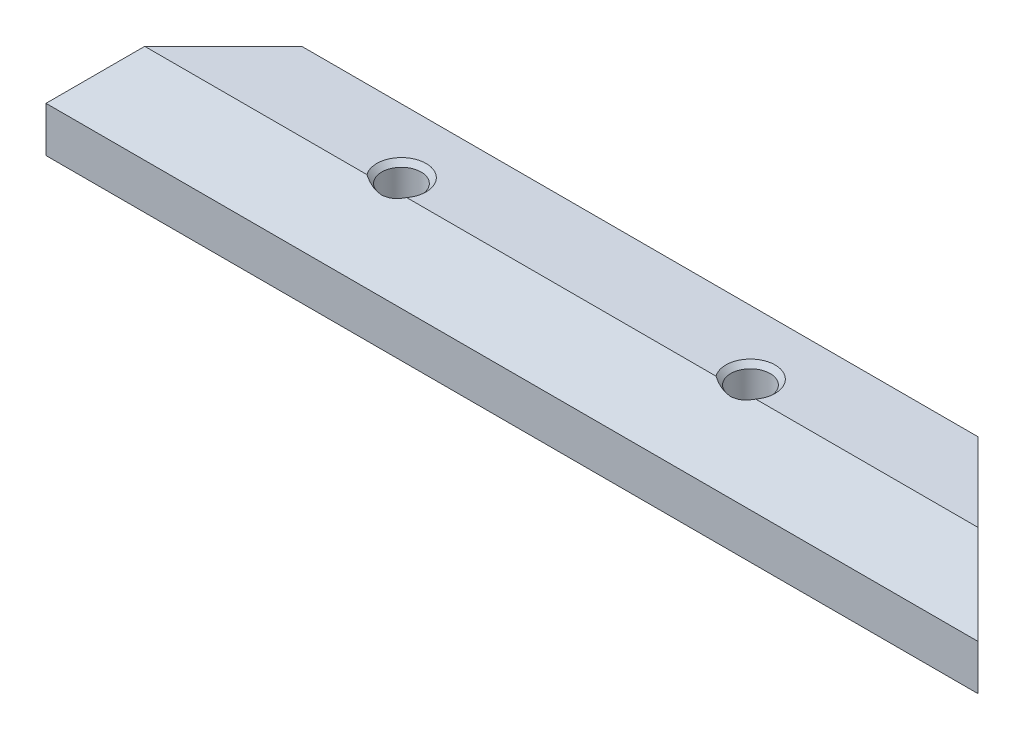
ISO-10303-21;
HEADER;
FILE_DESCRIPTION(('STEP AP214'),'2;1');
FILE_NAME('part.step','',(''),(''),'','','');
FILE_SCHEMA(('AUTOMOTIVE_DESIGN { 1 0 10303 214 1 1 1 1 }'));
ENDSEC;
DATA;
#1=APPLICATION_CONTEXT('core data for automotive mechanical design processes');
#2=APPLICATION_PROTOCOL_DEFINITION('international standard','automotive_design',2000,#1);
#3=PRODUCT_CONTEXT('',#1,'mechanical');
#4=PRODUCT('Part','Part','',(#3));
#5=PRODUCT_RELATED_PRODUCT_CATEGORY('part','',(#4));
#6=PRODUCT_DEFINITION_FORMATION('','',#4);
#7=PRODUCT_DEFINITION_CONTEXT('part definition',#1,'design');
#8=PRODUCT_DEFINITION('design','',#6,#7);
#9=PRODUCT_DEFINITION_SHAPE('','',#8);
#10=(LENGTH_UNIT() NAMED_UNIT(*) SI_UNIT(.MILLI.,.METRE.));
#11=(NAMED_UNIT(*) PLANE_ANGLE_UNIT() SI_UNIT($,.RADIAN.));
#12=(NAMED_UNIT(*) SI_UNIT($,.STERADIAN.) SOLID_ANGLE_UNIT());
#13=UNCERTAINTY_MEASURE_WITH_UNIT(LENGTH_MEASURE(1.E-05),#10,'distance_accuracy_value','');
#14=(GEOMETRIC_REPRESENTATION_CONTEXT(3) GLOBAL_UNCERTAINTY_ASSIGNED_CONTEXT((#13)) GLOBAL_UNIT_ASSIGNED_CONTEXT((#10,
#11,#12)) REPRESENTATION_CONTEXT('',''));
#15=CARTESIAN_POINT('',(0.,0.,0.));
#16=DIRECTION('',(0.,0.,1.));
#17=DIRECTION('',(1.,0.,0.));
#18=AXIS2_PLACEMENT_3D('',#15,#16,#17);
#19=CARTESIAN_POINT('',(35.3553390593204,0.,-12.955));
#20=DIRECTION('',(0.,1.,0.));
#21=DIRECTION('',(0.,0.,1.));
#22=AXIS2_PLACEMENT_3D('',#19,#20,#21);
#23=CYLINDRICAL_SURFACE('',#22,1.99999999999994);
#24=CARTESIAN_POINT('',(35.3553390593204,0.,-12.955));
#25=DIRECTION('',(0.,1.,0.));
#26=DIRECTION('',(0.,0.,1.));
#27=AXIS2_PLACEMENT_3D('',#24,#25,#26);
#28=CIRCLE('',#27,1.99999999999994);
#29=CARTESIAN_POINT('',(35.3553390593204,0.,-10.9550000000001));
#30=VERTEX_POINT('',#29);
#31=EDGE_CURVE('E241',#30,#30,#28,.T.);
#32=ORIENTED_EDGE('',*,*,#31,.F.);
#33=EDGE_LOOP('',(#32));
#34=FACE_BOUND('',#33,.T.);
#35=CARTESIAN_POINT('',(35.3553390593204,3.,-12.955));
#36=DIRECTION('',(0.,1.,0.));
#37=DIRECTION('',(0.,0.,1.));
#38=AXIS2_PLACEMENT_3D('',#35,#36,#37);
#39=CIRCLE('',#38,1.99999999999994);
#40=CARTESIAN_POINT('',(35.3553390593204,3.,-10.9550000000001));
#41=VERTEX_POINT('',#40);
#42=EDGE_CURVE('E237',#41,#41,#39,.F.);
#43=ORIENTED_EDGE('',*,*,#42,.F.);
#44=EDGE_LOOP('',(#43));
#45=FACE_BOUND('',#44,.T.);
#46=ADVANCED_FACE('F44',(#34,#45),#23,.F.);
#47=CARTESIAN_POINT('',(-35.3553390593342,0.,-12.955));
#48=DIRECTION('',(0.,1.,0.));
#49=DIRECTION('',(0.,0.,1.));
#50=AXIS2_PLACEMENT_3D('',#47,#48,#49);
#51=CYLINDRICAL_SURFACE('',#50,2.);
#52=CARTESIAN_POINT('',(-35.3553390593342,0.,-12.955));
#53=DIRECTION('',(0.,1.,0.));
#54=DIRECTION('',(0.,0.,1.));
#55=AXIS2_PLACEMENT_3D('',#52,#53,#54);
#56=CIRCLE('',#55,2.);
#57=CARTESIAN_POINT('',(-35.3553390593342,0.,-10.955));
#58=VERTEX_POINT('',#57);
#59=EDGE_CURVE('E172',#58,#58,#56,.T.);
#60=ORIENTED_EDGE('',*,*,#59,.F.);
#61=EDGE_LOOP('',(#60));
#62=FACE_BOUND('',#61,.T.);
#63=CARTESIAN_POINT('',(-35.3553390593342,3.,-12.955));
#64=DIRECTION('',(0.,1.,0.));
#65=DIRECTION('',(0.,0.,1.));
#66=AXIS2_PLACEMENT_3D('',#63,#64,#65);
#67=CIRCLE('',#66,2.);
#68=CARTESIAN_POINT('',(-35.3553390593342,3.,-10.955));
#69=VERTEX_POINT('',#68);
#70=EDGE_CURVE('E234',#69,#69,#67,.F.);
#71=ORIENTED_EDGE('',*,*,#70,.F.);
#72=EDGE_LOOP('',(#71));
#73=FACE_BOUND('',#72,.T.);
#74=ADVANCED_FACE('F314',(#62,#73),#51,.F.);
#75=CARTESIAN_POINT('',(68.5,3.,-25.91));
#76=DIRECTION('',(-0.707106781186549,0.,0.707106781186546));
#77=DIRECTION('',(0.707106781186546,0.,0.707106781186549));
#78=AXIS2_PLACEMENT_3D('',#75,#76,#77);
#79=PLANE('',#78);
#80=DIRECTION('',(-0.707106781186546,0.,-0.707106781186549));
#81=VECTOR('',#80,1.);
#82=CARTESIAN_POINT('',(68.5,19.17,-25.91));
#83=LINE('',#82,#81);
#84=CARTESIAN_POINT('',(84.41,19.17,-10.));
#85=VERTEX_POINT('',#84);
#86=CARTESIAN_POINT('',(68.5,19.17,-25.91));
#87=VERTEX_POINT('',#86);
#88=EDGE_CURVE('E140',#85,#87,#83,.T.);
#89=ORIENTED_EDGE('',*,*,#88,.F.);
#90=DIRECTION('',(-0.577350269189624,0.577350269189628,-0.577350269189626));
#91=VECTOR('',#90,1.);
#92=CARTESIAN_POINT('',(56.2733333333335,47.3066666666666,-38.1366666666666));
#93=LINE('',#92,#91);
#94=CARTESIAN_POINT('',(94.4099999999999,9.16999999999999,0.));
#95=VERTEX_POINT('',#94);
#96=EDGE_CURVE('E220',#85,#95,#93,.F.);
#97=ORIENTED_EDGE('',*,*,#96,.T.);
#98=DIRECTION('',(0.,-1.,0.));
#99=VECTOR('',#98,1.);
#100=CARTESIAN_POINT('',(94.4099999999999,3.,0.));
#101=LINE('',#100,#99);
#102=CARTESIAN_POINT('',(94.4099999999999,0.,0.));
#103=VERTEX_POINT('',#102);
#104=EDGE_CURVE('E204',#95,#103,#101,.T.);
#105=ORIENTED_EDGE('',*,*,#104,.T.);
#106=DIRECTION('',(-0.707106781186546,0.,-0.707106781186549));
#107=VECTOR('',#106,1.);
#108=CARTESIAN_POINT('',(68.5,0.,-25.91));
#109=LINE('',#108,#107);
#110=CARTESIAN_POINT('',(68.5,0.,-25.91));
#111=VERTEX_POINT('',#110);
#112=EDGE_CURVE('E158',#103,#111,#109,.T.);
#113=ORIENTED_EDGE('',*,*,#112,.T.);
#114=DIRECTION('',(0.,-1.,0.));
#115=VECTOR('',#114,1.);
#116=CARTESIAN_POINT('',(68.5,3.,-25.91));
#117=LINE('',#116,#115);
#118=EDGE_CURVE('E155',#87,#111,#117,.T.);
#119=ORIENTED_EDGE('',*,*,#118,.F.);
#120=EDGE_LOOP('',(#89,#97,#105,#113,#119));
#121=FACE_BOUND('',#120,.T.);
#122=ADVANCED_FACE('F156',(#121),#79,.F.);
#123=CARTESIAN_POINT('',(-68.5,3.,-25.91));
#124=DIRECTION('',(0.,0.,1.));
#125=DIRECTION('',(1.,0.,0.));
#126=AXIS2_PLACEMENT_3D('',#123,#124,#125);
#127=PLANE('',#126);
#128=DIRECTION('',(0.,-1.,0.));
#129=VECTOR('',#128,1.);
#130=CARTESIAN_POINT('',(64.4969448888859,15.,-25.91));
#131=LINE('',#130,#129);
#132=CARTESIAN_POINT('',(64.4969448888859,15.,-25.91));
#133=VERTEX_POINT('',#132);
#134=CARTESIAN_POINT('',(64.4969448888859,3.,-25.91));
#135=VERTEX_POINT('',#134);
#136=EDGE_CURVE('E199',#133,#135,#131,.T.);
#137=ORIENTED_EDGE('',*,*,#136,.F.);
#138=DIRECTION('',(-1.,0.,0.));
#139=VECTOR('',#138,1.);
#140=CARTESIAN_POINT('',(-68.5,15.,-25.91));
#141=LINE('',#140,#139);
#142=CARTESIAN_POINT('',(-64.496944888886,15.,-25.91));
#143=VERTEX_POINT('',#142);
#144=EDGE_CURVE('E151',#133,#143,#141,.T.);
#145=ORIENTED_EDGE('',*,*,#144,.T.);
#146=DIRECTION('',(0.,-1.,0.));
#147=VECTOR('',#146,1.);
#148=CARTESIAN_POINT('',(-64.496944888886,15.,-25.91));
#149=LINE('',#148,#147);
#150=CARTESIAN_POINT('',(-64.496944888886,3.,-25.91));
#151=VERTEX_POINT('',#150);
#152=EDGE_CURVE('E183',#143,#151,#149,.T.);
#153=ORIENTED_EDGE('',*,*,#152,.T.);
#154=DIRECTION('',(-1.,0.,0.));
#155=VECTOR('',#154,1.);
#156=CARTESIAN_POINT('',(-68.5,3.,-25.91));
#157=LINE('',#156,#155);
#158=EDGE_CURVE('E202',#135,#151,#157,.T.);
#159=ORIENTED_EDGE('',*,*,#158,.F.);
#160=EDGE_LOOP('',(#137,#145,#153,#159));
#161=FACE_BOUND('',#160,.T.);
#162=DIRECTION('',(-1.,0.,0.));
#163=VECTOR('',#162,1.);
#164=CARTESIAN_POINT('',(-68.5,0.,-25.91));
#165=LINE('',#164,#163);
#166=CARTESIAN_POINT('',(-68.5,0.,-25.91));
#167=VERTEX_POINT('',#166);
#168=EDGE_CURVE('E207',#111,#167,#165,.T.);
#169=ORIENTED_EDGE('',*,*,#168,.T.);
#170=DIRECTION('',(0.,-1.,0.));
#171=VECTOR('',#170,1.);
#172=CARTESIAN_POINT('',(-68.5,3.,-25.91));
#173=LINE('',#172,#171);
#174=CARTESIAN_POINT('',(-68.5,19.17,-25.91));
#175=VERTEX_POINT('',#174);
#176=EDGE_CURVE('E160',#175,#167,#173,.T.);
#177=ORIENTED_EDGE('',*,*,#176,.F.);
#178=DIRECTION('',(-1.,0.,0.));
#179=VECTOR('',#178,1.);
#180=CARTESIAN_POINT('',(-68.5,19.17,-25.91));
#181=LINE('',#180,#179);
#182=EDGE_CURVE('E145',#87,#175,#181,.T.);
#183=ORIENTED_EDGE('',*,*,#182,.F.);
#184=ORIENTED_EDGE('',*,*,#118,.T.);
#185=EDGE_LOOP('',(#169,#177,#183,#184));
#186=FACE_BOUND('',#185,.T.);
#187=ADVANCED_FACE('F162',(#161,#186),#127,.F.);
#188=CARTESIAN_POINT('',(-94.4099999999999,3.,0.));
#189=DIRECTION('',(0.707106781186549,0.,0.707106781186547));
#190=DIRECTION('',(0.707106781186547,0.,-0.707106781186549));
#191=AXIS2_PLACEMENT_3D('',#188,#189,#190);
#192=PLANE('',#191);
#193=DIRECTION('',(0.,-1.,0.));
#194=VECTOR('',#193,1.);
#195=CARTESIAN_POINT('',(-94.4099999999999,3.,0.));
#196=LINE('',#195,#194);
#197=CARTESIAN_POINT('',(-94.4099999999999,9.16999999999999,0.));
#198=VERTEX_POINT('',#197);
#199=CARTESIAN_POINT('',(-94.4099999999999,0.,0.));
#200=VERTEX_POINT('',#199);
#201=EDGE_CURVE('E215',#198,#200,#196,.T.);
#202=ORIENTED_EDGE('',*,*,#201,.F.);
#203=DIRECTION('',(-0.577350269189624,-0.577350269189628,0.577350269189626));
#204=VECTOR('',#203,1.);
#205=CARTESIAN_POINT('',(-56.2733333333334,47.3066666666666,-38.1366666666666));
#206=LINE('',#205,#204);
#207=CARTESIAN_POINT('',(-84.4099999999999,19.17,-10.));
#208=VERTEX_POINT('',#207);
#209=EDGE_CURVE('E225',#198,#208,#206,.F.);
#210=ORIENTED_EDGE('',*,*,#209,.T.);
#211=DIRECTION('',(-0.707106781186546,0.,0.707106781186548));
#212=VECTOR('',#211,1.);
#213=CARTESIAN_POINT('',(-94.4099999999999,19.17,0.));
#214=LINE('',#213,#212);
#215=EDGE_CURVE('E164',#175,#208,#214,.T.);
#216=ORIENTED_EDGE('',*,*,#215,.F.);
#217=ORIENTED_EDGE('',*,*,#176,.T.);
#218=DIRECTION('',(-0.707106781186546,0.,0.707106781186548));
#219=VECTOR('',#218,1.);
#220=CARTESIAN_POINT('',(-94.4099999999999,0.,0.));
#221=LINE('',#220,#219);
#222=EDGE_CURVE('E209',#167,#200,#221,.T.);
#223=ORIENTED_EDGE('',*,*,#222,.T.);
#224=EDGE_LOOP('',(#202,#210,#216,#217,#223));
#225=FACE_BOUND('',#224,.T.);
#226=ADVANCED_FACE('F357',(#225),#192,.F.);
#227=CARTESIAN_POINT('',(-94.4099999999999,3.,0.));
#228=DIRECTION('',(0.,0.,-1.));
#229=DIRECTION('',(-1.,0.,0.));
#230=AXIS2_PLACEMENT_3D('',#227,#228,#229);
#231=PLANE('',#230);
#232=ORIENTED_EDGE('',*,*,#104,.F.);
#233=DIRECTION('',(-1.,0.,0.));
#234=VECTOR('',#233,1.);
#235=CARTESIAN_POINT('',(-94.4099999999999,9.16999999999999,0.));
#236=LINE('',#235,#234);
#237=EDGE_CURVE('E223',#95,#198,#236,.T.);
#238=ORIENTED_EDGE('',*,*,#237,.T.);
#239=ORIENTED_EDGE('',*,*,#201,.T.);
#240=DIRECTION('',(1.,0.,0.));
#241=VECTOR('',#240,1.);
#242=CARTESIAN_POINT('',(-94.4099999999999,0.,0.));
#243=LINE('',#242,#241);
#244=EDGE_CURVE('E205',#200,#103,#243,.T.);
#245=ORIENTED_EDGE('',*,*,#244,.T.);
#246=EDGE_LOOP('',(#232,#238,#239,#245));
#247=FACE_BOUND('',#246,.T.);
#248=ADVANCED_FACE('F350',(#247),#231,.F.);
#249=CARTESIAN_POINT('',(0.,3.,0.));
#250=DIRECTION('',(0.,1.,0.));
#251=DIRECTION('',(0.,0.,1.));
#252=AXIS2_PLACEMENT_3D('',#249,#250,#251);
#253=PLANE('',#252);
#254=CARTESIAN_POINT('',(-64.496944888886,3.,24.09));
#255=DIRECTION('',(0.,1.,0.));
#256=DIRECTION('',(0.,0.,1.));
#257=AXIS2_PLACEMENT_3D('',#254,#255,#256);
#258=CIRCLE('',#257,50.);
#259=CARTESIAN_POINT('',(-45.5272552156842,3.,-22.1717647058823));
#260=VERTEX_POINT('',#259);
#261=EDGE_CURVE('E177',#260,#151,#258,.T.);
#262=ORIENTED_EDGE('',*,*,#261,.F.);
#263=CARTESIAN_POINT('',(0.,3.,-133.2));
#264=DIRECTION('',(0.,-1.,0.));
#265=DIRECTION('',(0.,0.,1.));
#266=AXIS2_PLACEMENT_3D('',#263,#264,#265);
#267=CIRCLE('',#266,120.);
#268=CARTESIAN_POINT('',(45.5272552156842,3.,-22.1717647058823));
#269=VERTEX_POINT('',#268);
#270=EDGE_CURVE('E186',#269,#260,#267,.T.);
#271=ORIENTED_EDGE('',*,*,#270,.F.);
#272=CARTESIAN_POINT('',(64.4969448888859,3.,24.09));
#273=DIRECTION('',(0.,1.,0.));
#274=DIRECTION('',(0.,0.,-1.));
#275=AXIS2_PLACEMENT_3D('',#272,#273,#274);
#276=CIRCLE('',#275,50.);
#277=EDGE_CURVE('E166',#135,#269,#276,.T.);
#278=ORIENTED_EDGE('',*,*,#277,.F.);
#279=ORIENTED_EDGE('',*,*,#158,.T.);
#280=EDGE_LOOP('',(#262,#271,#278,#279));
#281=FACE_BOUND('',#280,.T.);
#282=ADVANCED_FACE('F347',(#281),#253,.T.);
#283=CARTESIAN_POINT('',(0.,0.,0.));
#284=DIRECTION('',(0.,1.,0.));
#285=DIRECTION('',(0.,0.,1.));
#286=AXIS2_PLACEMENT_3D('',#283,#284,#285);
#287=PLANE('',#286);
#288=ORIENTED_EDGE('',*,*,#59,.T.);
#289=EDGE_LOOP('',(#288));
#290=FACE_BOUND('',#289,.T.);
#291=ORIENTED_EDGE('',*,*,#31,.T.);
#292=EDGE_LOOP('',(#291));
#293=FACE_BOUND('',#292,.T.);
#294=ORIENTED_EDGE('',*,*,#112,.F.);
#295=ORIENTED_EDGE('',*,*,#244,.F.);
#296=ORIENTED_EDGE('',*,*,#222,.F.);
#297=ORIENTED_EDGE('',*,*,#168,.F.);
#298=EDGE_LOOP('',(#294,#295,#296,#297));
#299=FACE_BOUND('',#298,.T.);
#300=ADVANCED_FACE('F309',(#290,#293,#299),#287,.F.);
#301=CARTESIAN_POINT('',(64.4969448888859,15.,24.09));
#302=DIRECTION('',(0.,-1.,0.));
#303=DIRECTION('',(0.,0.,-1.));
#304=AXIS2_PLACEMENT_3D('',#301,#302,#303);
#305=CYLINDRICAL_SURFACE('',#304,50.);
#306=ORIENTED_EDGE('',*,*,#277,.T.);
#307=DIRECTION('',(0.,-1.,0.));
#308=VECTOR('',#307,1.);
#309=CARTESIAN_POINT('',(45.5272552156842,15.,-22.1717647058823));
#310=LINE('',#309,#308);
#311=CARTESIAN_POINT('',(45.5272552156842,15.,-22.1717647058823));
#312=VERTEX_POINT('',#311);
#313=EDGE_CURVE('E196',#312,#269,#310,.T.);
#314=ORIENTED_EDGE('',*,*,#313,.F.);
#315=CARTESIAN_POINT('',(64.4969448888859,15.,24.09));
#316=DIRECTION('',(0.,1.,0.));
#317=DIRECTION('',(0.,0.,-1.));
#318=AXIS2_PLACEMENT_3D('',#315,#316,#317);
#319=CIRCLE('',#318,50.);
#320=EDGE_CURVE('E173',#133,#312,#319,.T.);
#321=ORIENTED_EDGE('',*,*,#320,.F.);
#322=ORIENTED_EDGE('',*,*,#136,.T.);
#323=EDGE_LOOP('',(#306,#314,#321,#322));
#324=FACE_BOUND('',#323,.T.);
#325=ADVANCED_FACE('F342',(#324),#305,.T.);
#326=CARTESIAN_POINT('',(0.,15.,-133.2));
#327=DIRECTION('',(0.,-1.,0.));
#328=DIRECTION('',(0.,0.,-1.));
#329=AXIS2_PLACEMENT_3D('',#326,#327,#328);
#330=CYLINDRICAL_SURFACE('',#329,120.);
#331=ORIENTED_EDGE('',*,*,#270,.T.);
#332=DIRECTION('',(0.,-1.,0.));
#333=VECTOR('',#332,1.);
#334=CARTESIAN_POINT('',(-45.5272552156842,15.,-22.1717647058823));
#335=LINE('',#334,#333);
#336=CARTESIAN_POINT('',(-45.5272552156842,15.,-22.1717647058823));
#337=VERTEX_POINT('',#336);
#338=EDGE_CURVE('E193',#337,#260,#335,.T.);
#339=ORIENTED_EDGE('',*,*,#338,.F.);
#340=CARTESIAN_POINT('',(0.,15.,-133.2));
#341=DIRECTION('',(0.,-1.,0.));
#342=DIRECTION('',(0.,0.,1.));
#343=AXIS2_PLACEMENT_3D('',#340,#341,#342);
#344=CIRCLE('',#343,120.);
#345=EDGE_CURVE('E176',#312,#337,#344,.T.);
#346=ORIENTED_EDGE('',*,*,#345,.F.);
#347=ORIENTED_EDGE('',*,*,#313,.T.);
#348=EDGE_LOOP('',(#331,#339,#346,#347));
#349=FACE_BOUND('',#348,.T.);
#350=ADVANCED_FACE('F338',(#349),#330,.F.);
#351=CARTESIAN_POINT('',(-64.496944888886,15.,24.09));
#352=DIRECTION('',(0.,-1.,0.));
#353=DIRECTION('',(0.,0.,-1.));
#354=AXIS2_PLACEMENT_3D('',#351,#352,#353);
#355=CYLINDRICAL_SURFACE('',#354,50.);
#356=ORIENTED_EDGE('',*,*,#261,.T.);
#357=ORIENTED_EDGE('',*,*,#152,.F.);
#358=CARTESIAN_POINT('',(-64.496944888886,15.,24.09));
#359=DIRECTION('',(0.,1.,0.));
#360=DIRECTION('',(0.,0.,1.));
#361=AXIS2_PLACEMENT_3D('',#358,#359,#360);
#362=CIRCLE('',#361,50.);
#363=EDGE_CURVE('E180',#337,#143,#362,.T.);
#364=ORIENTED_EDGE('',*,*,#363,.F.);
#365=ORIENTED_EDGE('',*,*,#338,.T.);
#366=EDGE_LOOP('',(#356,#357,#364,#365));
#367=FACE_BOUND('',#366,.T.);
#368=ADVANCED_FACE('F332',(#367),#355,.T.);
#369=CARTESIAN_POINT('',(0.,19.17,0.));
#370=DIRECTION('',(0.,-1.,0.));
#371=DIRECTION('',(0.,0.,-1.));
#372=AXIS2_PLACEMENT_3D('',#369,#370,#371);
#373=PLANE('',#372);
#374=DIRECTION('',(1.,0.,0.));
#375=VECTOR('',#374,1.);
#376=CARTESIAN_POINT('',(0.,19.17,-10.));
#377=LINE('',#376,#375);
#378=CARTESIAN_POINT('',(-39.3886968416293,19.17,-10.));
#379=VERTEX_POINT('',#378);
#380=EDGE_CURVE('E218',#208,#379,#377,.T.);
#381=ORIENTED_EDGE('',*,*,#380,.T.);
#382=CARTESIAN_POINT('',(-35.3553390593342,19.17,-12.955));
#383=DIRECTION('',(0.,-1.,0.));
#384=DIRECTION('',(0.,0.,-1.));
#385=AXIS2_PLACEMENT_3D('',#382,#383,#384);
#386=CIRCLE('',#385,5.00000000000009);
#387=CARTESIAN_POINT('',(-31.3219812770391,19.17,-10.));
#388=VERTEX_POINT('',#387);
#389=EDGE_CURVE('E54',#379,#388,#386,.T.);
#390=ORIENTED_EDGE('',*,*,#389,.T.);
#391=CARTESIAN_POINT('',(31.3219812770253,19.17,-10.));
#392=VERTEX_POINT('',#391);
#393=EDGE_CURVE('E221',#388,#392,#377,.T.);
#394=ORIENTED_EDGE('',*,*,#393,.T.);
#395=CARTESIAN_POINT('',(35.3553390593204,19.17,-12.955));
#396=DIRECTION('',(0.,-1.,0.));
#397=DIRECTION('',(0.,0.,-1.));
#398=AXIS2_PLACEMENT_3D('',#395,#396,#397);
#399=CIRCLE('',#398,5.00000000000009);
#400=CARTESIAN_POINT('',(39.3886968416156,19.17,-10.));
#401=VERTEX_POINT('',#400);
#402=EDGE_CURVE('E284',#392,#401,#399,.T.);
#403=ORIENTED_EDGE('',*,*,#402,.T.);
#404=EDGE_CURVE('E148',#401,#85,#377,.T.);
#405=ORIENTED_EDGE('',*,*,#404,.T.);
#406=ORIENTED_EDGE('',*,*,#88,.T.);
#407=ORIENTED_EDGE('',*,*,#182,.T.);
#408=ORIENTED_EDGE('',*,*,#215,.T.);
#409=EDGE_LOOP('',(#381,#390,#394,#403,#405,#406,#407,#408));
#410=FACE_BOUND('',#409,.T.);
#411=ADVANCED_FACE('F142',(#410),#373,.F.);
#412=CARTESIAN_POINT('',(0.,15.,0.));
#413=DIRECTION('',(0.,-1.,0.));
#414=DIRECTION('',(0.,0.,-1.));
#415=AXIS2_PLACEMENT_3D('',#412,#413,#414);
#416=PLANE('',#415);
#417=ORIENTED_EDGE('',*,*,#144,.F.);
#418=ORIENTED_EDGE('',*,*,#320,.T.);
#419=ORIENTED_EDGE('',*,*,#345,.T.);
#420=ORIENTED_EDGE('',*,*,#363,.T.);
#421=EDGE_LOOP('',(#417,#418,#419,#420));
#422=FACE_BOUND('',#421,.T.);
#423=ADVANCED_FACE('F265',(#422),#416,.T.);
#424=CARTESIAN_POINT('',(0.,19.17,-10.));
#425=DIRECTION('',(0.,-0.707106781186546,-0.707106781186548));
#426=DIRECTION('',(1.,0.,0.));
#427=AXIS2_PLACEMENT_3D('',#424,#425,#426);
#428=PLANE('',#427);
#429=CARTESIAN_POINT('',(-35.3553390593342,22.125,-12.955));
#430=DIRECTION('',(0.,-0.707106781186546,-0.707106781186548));
#431=DIRECTION('',(0.,0.707106781186549,-0.707106781186547));
#432=AXIS2_PLACEMENT_3D('',#429,#430,#431);
#433=ELLIPSE('',#432,5.6568542494924,4.00000000000001);
#434=CARTESIAN_POINT('',(-35.9536491795889,18.1699999999999,-8.99999999999991));
#435=VERTEX_POINT('',#434);
#436=CARTESIAN_POINT('',(-34.7570289390795,18.1699999999999,-8.99999999999991));
#437=VERTEX_POINT('',#436);
#438=EDGE_CURVE('E230',#435,#437,#433,.F.);
#439=ORIENTED_EDGE('',*,*,#438,.F.);
#440=CARTESIAN_POINT('',(-35.9536491795889,18.1699999999999,-8.99999999999991));
#441=CARTESIAN_POINT('',(-36.038581314557,18.1763859113228,-9.00638591132283));
#442=CARTESIAN_POINT('',(-36.1232972799737,18.1841200847109,-9.01412008471089));
#443=CARTESIAN_POINT('',(-36.2921554224371,18.202214182413,-9.03221418241295));
#444=CARTESIAN_POINT('',(-36.3762976752482,18.2125737528401,-9.04257375284011));
#445=CARTESIAN_POINT('',(-36.6274501815585,18.247454815301,-9.07745481530099));
#446=CARTESIAN_POINT('',(-36.7934259042502,18.2757970304514,-9.10579703045137));
#447=CARTESIAN_POINT('',(-37.1187058988769,18.3413053763123,-9.17130537631226));
#448=CARTESIAN_POINT('',(-37.2780758758189,18.3783107504277,-9.20831075042774));
#449=CARTESIAN_POINT('',(-37.5925432928602,18.4605330439998,-9.29053304399983));
#450=CARTESIAN_POINT('',(-37.7476398448323,18.5057516557725,-9.33575165577247));
#451=CARTESIAN_POINT('',(-38.0305207821797,18.5962524706818,-9.42625247068182));
#452=CARTESIAN_POINT('',(-38.15895062628,18.6405351503513,-9.47053515035127));
#453=CARTESIAN_POINT('',(-38.4122953930816,18.7338569338251,-9.56385693382508));
#454=CARTESIAN_POINT('',(-38.5372103977451,18.7828959265985,-9.61289592659852));
#455=CARTESIAN_POINT('',(-38.7853838196336,18.8860019578628,-9.71600195786278));
#456=CARTESIAN_POINT('',(-38.9085875608926,18.9401345030679,-9.77013450306789));
#457=CARTESIAN_POINT('',(-39.1513486511318,19.0522757578777,-9.88227575787772));
#458=CARTESIAN_POINT('',(-39.2709074664442,19.1102828779769,-9.94028287797692));
#459=CARTESIAN_POINT('',(-39.3886968416293,19.17,-10.));
#460=B_SPLINE_CURVE_WITH_KNOTS('',3,(#440,#441,#442,#443,#444,#445,#446,#447,#448,#449,#450,
#451,#452,#453,#454,#455,#456,#457,#458,#459),.UNSPECIFIED.,.F.,.F.,(4,2,2,2,2,2,2,2,2,4),(0.,
0.25618662725926,0.512338740538179,1.02392207797307,1.52667483717736,2.02953130502386,
2.45797834800853,2.88641539177367,3.32141446551309,3.75623616844724),.UNSPECIFIED.);
#461=EDGE_CURVE('E278',#435,#379,#460,.T.);
#462=ORIENTED_EDGE('',*,*,#461,.T.);
#463=ORIENTED_EDGE('',*,*,#380,.F.);
#464=ORIENTED_EDGE('',*,*,#209,.F.);
#465=ORIENTED_EDGE('',*,*,#237,.F.);
#466=ORIENTED_EDGE('',*,*,#96,.F.);
#467=ORIENTED_EDGE('',*,*,#404,.F.);
#468=CARTESIAN_POINT('',(39.3886968416156,19.17,-10.));
#469=CARTESIAN_POINT('',(39.1836533820432,19.066060966142,-9.89606096614199));
#470=CARTESIAN_POINT('',(38.9730766143768,18.9672008693444,-9.79720086934444));
#471=CARTESIAN_POINT('',(38.539914341824,18.7819618561465,-9.61196185614655));
#472=CARTESIAN_POINT('',(38.3172770469669,18.6956437858443,-9.52564378584427));
#473=CARTESIAN_POINT('',(37.8677923904058,18.5411824392486,-9.3711824392486));
#474=CARTESIAN_POINT('',(37.6412692264823,18.4725734432918,-9.30257344329182));
#475=CARTESIAN_POINT('',(37.1793895526884,18.3532857731357,-9.18328577313574));
#476=CARTESIAN_POINT('',(36.9440550656881,18.3025653175001,-9.13256531750009));
#477=CARTESIAN_POINT('',(36.5820713726768,18.2411296882006,-9.07112968820064));
#478=CARTESIAN_POINT('',(36.4579066464539,18.2229304522864,-9.05293045228643));
#479=CARTESIAN_POINT('',(36.2072187082103,18.1921155109619,-9.02211551096189));
#480=CARTESIAN_POINT('',(36.0806847033068,18.1795438027441,-9.00954380274406));
#481=CARTESIAN_POINT('',(35.9536491795751,18.1699999999999,-8.99999999999989));
#482=B_SPLINE_CURVE_WITH_KNOTS('',3,(#468,#469,#470,#471,#472,#473,#474,#475,#476,#477,#478,
#479,#480,#481),.UNSPECIFIED.,.F.,.F.,(4,2,2,2,2,2,4),(0.,0.757182028362938,1.51792285351372,
2.25594893936731,2.99223965488723,3.3724153017568,3.75551343671145),.UNSPECIFIED.);
#483=CARTESIAN_POINT('',(35.953649179575,18.1699999999999,-8.9999999999999));
#484=VERTEX_POINT('',#483);
#485=EDGE_CURVE('E244',#401,#484,#482,.T.);
#486=ORIENTED_EDGE('',*,*,#485,.T.);
#487=CARTESIAN_POINT('',(35.3553390593204,22.125,-12.955));
#488=DIRECTION('',(0.,-0.707106781186546,-0.707106781186548));
#489=DIRECTION('',(0.,0.707106781186549,-0.707106781186547));
#490=AXIS2_PLACEMENT_3D('',#487,#488,#489);
#491=ELLIPSE('',#490,5.65685424949239,4.);
#492=CARTESIAN_POINT('',(34.7570289390658,18.1699999999999,-8.9999999999999));
#493=VERTEX_POINT('',#492);
#494=EDGE_CURVE('E227',#493,#484,#491,.F.);
#495=ORIENTED_EDGE('',*,*,#494,.F.);
#496=CARTESIAN_POINT('',(34.7570289390658,18.1699999999999,-8.9999999999999));
#497=CARTESIAN_POINT('',(34.6720968040977,18.1763859113228,-9.00638591132282));
#498=CARTESIAN_POINT('',(34.587380838681,18.1841200847109,-9.01412008471088));
#499=CARTESIAN_POINT('',(34.4185226962176,18.2022141824129,-9.03221418241294));
#500=CARTESIAN_POINT('',(34.3343804434065,18.2125737528401,-9.0425737528401));
#501=CARTESIAN_POINT('',(34.0832279370962,18.247454815301,-9.07745481530098));
#502=CARTESIAN_POINT('',(33.9172522144045,18.2757970304514,-9.10579703045136));
#503=CARTESIAN_POINT('',(33.5919722197778,18.3413053763122,-9.17130537631224));
#504=CARTESIAN_POINT('',(33.4326022428358,18.3783107504277,-9.20831075042772));
#505=CARTESIAN_POINT('',(33.1181348257945,18.4605330439998,-9.2905330439998));
#506=CARTESIAN_POINT('',(32.9630382738224,18.5057516557724,-9.33575165577244));
#507=CARTESIAN_POINT('',(32.680157336475,18.5962524706818,-9.42625247068178));
#508=CARTESIAN_POINT('',(32.5517274923747,18.6405351503512,-9.47053515035124));
#509=CARTESIAN_POINT('',(32.2983827255731,18.733856933825,-9.56385693382505));
#510=CARTESIAN_POINT('',(32.1734677209095,18.7828959265985,-9.61289592659849));
#511=CARTESIAN_POINT('',(31.9252942990211,18.8860019578628,-9.71600195786275));
#512=CARTESIAN_POINT('',(31.8020905577621,18.9401345030679,-9.77013450306788));
#513=CARTESIAN_POINT('',(31.5593294675228,19.0522757578777,-9.88227575787771));
#514=CARTESIAN_POINT('',(31.4397706522104,19.1102828779769,-9.94028287797692));
#515=CARTESIAN_POINT('',(31.3219812770253,19.17,-10.));
#516=B_SPLINE_CURVE_WITH_KNOTS('',3,(#496,#497,#498,#499,#500,#501,#502,#503,#504,#505,#506,
#507,#508,#509,#510,#511,#512,#513,#514,#515),.UNSPECIFIED.,.F.,.F.,(4,2,2,2,2,2,2,2,2,4),(0.,
0.256186627259252,0.512338740538178,1.02392207797306,1.52667483717734,2.02953130502383,
2.45797834800854,2.88641539177369,3.32141446551315,3.75623616844733),.UNSPECIFIED.);
#517=EDGE_CURVE('E61',#493,#392,#516,.T.);
#518=ORIENTED_EDGE('',*,*,#517,.T.);
#519=ORIENTED_EDGE('',*,*,#393,.F.);
#520=CARTESIAN_POINT('',(-31.3219812770391,19.17,-10.));
#521=CARTESIAN_POINT('',(-31.5270247366114,19.066060966142,-9.89606096614199));
#522=CARTESIAN_POINT('',(-31.7376015042778,18.9672008693444,-9.79720086934444));
#523=CARTESIAN_POINT('',(-32.1707637768307,18.7819618561465,-9.61196185614654));
#524=CARTESIAN_POINT('',(-32.3934010716877,18.6956437858443,-9.52564378584427));
#525=CARTESIAN_POINT('',(-32.8428857282488,18.5411824392486,-9.3711824392486));
#526=CARTESIAN_POINT('',(-33.0694088921723,18.4725734432918,-9.30257344329182));
#527=CARTESIAN_POINT('',(-33.5312885659662,18.3532857731357,-9.18328577313574));
#528=CARTESIAN_POINT('',(-33.7666230529666,18.3025653175001,-9.13256531750009));
#529=CARTESIAN_POINT('',(-34.1286067459778,18.2411296882006,-9.07112968820065));
#530=CARTESIAN_POINT('',(-34.2527714722006,18.2229304522864,-9.05293045228644));
#531=CARTESIAN_POINT('',(-34.5034594104443,18.1921155109619,-9.0221155109619));
#532=CARTESIAN_POINT('',(-34.6299934153477,18.1795438027441,-9.00954380274407));
#533=CARTESIAN_POINT('',(-34.7570289390795,18.1699999999999,-8.9999999999999));
#534=B_SPLINE_CURVE_WITH_KNOTS('',3,(#520,#521,#522,#523,#524,#525,#526,#527,#528,#529,#530,
#531,#532,#533),.UNSPECIFIED.,.F.,.F.,(4,2,2,2,2,2,4),(0.,0.757182028362945,1.51792285351373,
2.25594893936732,2.99223965488724,3.37241530175676,3.75551343671136),.UNSPECIFIED.);
#535=EDGE_CURVE('E273',#388,#437,#534,.T.);
#536=ORIENTED_EDGE('',*,*,#535,.T.);
#537=EDGE_LOOP('',(#439,#462,#463,#464,#465,#466,#467,#486,#495,#518,#519,#536));
#538=FACE_BOUND('',#537,.T.);
#539=ADVANCED_FACE('F257',(#538),#428,.F.);
#540=CARTESIAN_POINT('',(0.,3.,0.));
#541=DIRECTION('',(0.,1.,0.));
#542=DIRECTION('',(0.,0.,1.));
#543=AXIS2_PLACEMENT_3D('',#540,#541,#542);
#544=PLANE('',#543);
#545=CARTESIAN_POINT('',(35.3553390593204,3.,-12.955));
#546=DIRECTION('',(0.,1.,0.));
#547=DIRECTION('',(0.,0.,1.));
#548=AXIS2_PLACEMENT_3D('',#545,#546,#547);
#549=CIRCLE('',#548,4.);
#550=CARTESIAN_POINT('',(35.3553390593204,3.,-8.95500000000001));
#551=VERTEX_POINT('',#550);
#552=EDGE_CURVE('E299',#551,#551,#549,.F.);
#553=ORIENTED_EDGE('',*,*,#552,.F.);
#554=EDGE_LOOP('',(#553));
#555=FACE_BOUND('',#554,.T.);
#556=ORIENTED_EDGE('',*,*,#42,.T.);
#557=EDGE_LOOP('',(#556));
#558=FACE_BOUND('',#557,.T.);
#559=ADVANCED_FACE('F264',(#555,#558),#544,.T.);
#560=CARTESIAN_POINT('',(35.3553390593204,-11.3137084989848,-12.955));
#561=DIRECTION('',(0.,1.,0.));
#562=DIRECTION('',(0.,0.,1.));
#563=AXIS2_PLACEMENT_3D('',#560,#561,#562);
#564=CYLINDRICAL_SURFACE('',#563,4.);
#565=ORIENTED_EDGE('',*,*,#494,.T.);
#566=CARTESIAN_POINT('',(35.3553390593204,18.1699999999999,-12.955));
#567=DIRECTION('',(0.,-1.,0.));
#568=DIRECTION('',(0.,0.,-1.));
#569=AXIS2_PLACEMENT_3D('',#566,#567,#568);
#570=CIRCLE('',#569,4.);
#571=EDGE_CURVE('E13',#484,#493,#570,.F.);
#572=ORIENTED_EDGE('',*,*,#571,.T.);
#573=EDGE_LOOP('',(#565,#572));
#574=FACE_BOUND('',#573,.T.);
#575=ORIENTED_EDGE('',*,*,#552,.T.);
#576=EDGE_LOOP('',(#575));
#577=FACE_BOUND('',#576,.T.);
#578=ADVANCED_FACE('F292',(#574,#577),#564,.F.);
#579=CARTESIAN_POINT('',(0.,3.,0.));
#580=DIRECTION('',(0.,1.,0.));
#581=DIRECTION('',(0.,0.,1.));
#582=AXIS2_PLACEMENT_3D('',#579,#580,#581);
#583=PLANE('',#582);
#584=CARTESIAN_POINT('',(-35.3553390593342,3.,-12.955));
#585=DIRECTION('',(0.,1.,0.));
#586=DIRECTION('',(0.,0.,1.));
#587=AXIS2_PLACEMENT_3D('',#584,#585,#586);
#588=CIRCLE('',#587,4.00000000000001);
#589=CARTESIAN_POINT('',(-35.3553390593342,3.,-8.95500000000001));
#590=VERTEX_POINT('',#589);
#591=EDGE_CURVE('E238',#590,#590,#588,.F.);
#592=ORIENTED_EDGE('',*,*,#591,.F.);
#593=EDGE_LOOP('',(#592));
#594=FACE_BOUND('',#593,.T.);
#595=ORIENTED_EDGE('',*,*,#70,.T.);
#596=EDGE_LOOP('',(#595));
#597=FACE_BOUND('',#596,.T.);
#598=ADVANCED_FACE('F295',(#594,#597),#583,.T.);
#599=CARTESIAN_POINT('',(-35.3553390593342,-11.3137084989848,-12.955));
#600=DIRECTION('',(0.,1.,0.));
#601=DIRECTION('',(0.,0.,1.));
#602=AXIS2_PLACEMENT_3D('',#599,#600,#601);
#603=CYLINDRICAL_SURFACE('',#602,4.00000000000001);
#604=ORIENTED_EDGE('',*,*,#438,.T.);
#605=CARTESIAN_POINT('',(-35.3553390593342,18.1699999999999,-12.955));
#606=DIRECTION('',(0.,-1.,0.));
#607=DIRECTION('',(0.,0.,-1.));
#608=AXIS2_PLACEMENT_3D('',#605,#606,#607);
#609=CIRCLE('',#608,4.00000000000001);
#610=EDGE_CURVE('E233',#437,#435,#609,.F.);
#611=ORIENTED_EDGE('',*,*,#610,.T.);
#612=EDGE_LOOP('',(#604,#611));
#613=FACE_BOUND('',#612,.T.);
#614=ORIENTED_EDGE('',*,*,#591,.T.);
#615=EDGE_LOOP('',(#614));
#616=FACE_BOUND('',#615,.T.);
#617=ADVANCED_FACE('F325',(#613,#616),#603,.F.);
#618=CARTESIAN_POINT('',(-35.3553390593342,18.1699999999999,-12.955));
#619=DIRECTION('',(0.,1.,0.));
#620=DIRECTION('',(0.,0.,1.));
#621=AXIS2_PLACEMENT_3D('',#618,#619,#620);
#622=CONICAL_SURFACE('',#621,4.00000000000001,0.785398163397444);
#623=ORIENTED_EDGE('',*,*,#535,.F.);
#624=ORIENTED_EDGE('',*,*,#389,.F.);
#625=ORIENTED_EDGE('',*,*,#461,.F.);
#626=ORIENTED_EDGE('',*,*,#610,.F.);
#627=EDGE_LOOP('',(#623,#624,#625,#626));
#628=FACE_BOUND('',#627,.T.);
#629=ADVANCED_FACE('F267',(#628),#622,.F.);
#630=CARTESIAN_POINT('',(35.3553390593204,18.1699999999999,-12.955));
#631=DIRECTION('',(0.,1.,0.));
#632=DIRECTION('',(0.,0.,1.));
#633=AXIS2_PLACEMENT_3D('',#630,#631,#632);
#634=CONICAL_SURFACE('',#633,4.,0.785398163397444);
#635=ORIENTED_EDGE('',*,*,#485,.F.);
#636=ORIENTED_EDGE('',*,*,#402,.F.);
#637=ORIENTED_EDGE('',*,*,#517,.F.);
#638=ORIENTED_EDGE('',*,*,#571,.F.);
#639=EDGE_LOOP('',(#635,#636,#637,#638));
#640=FACE_BOUND('',#639,.T.);
#641=ADVANCED_FACE('F47',(#640),#634,.F.);
#642=CLOSED_SHELL('',(#46,#74,#122,#187,#226,#248,#282,#300,#325,#350,#368,#411,#423,#539,#559,
#578,#598,#617,#629,#641));
#643=MANIFOLD_SOLID_BREP('B2',#642);
#644=ADVANCED_BREP_SHAPE_REPRESENTATION('',(#18,#643),#14);
#645=SHAPE_DEFINITION_REPRESENTATION(#9,#644);
ENDSEC;
END-ISO-10303-21;
